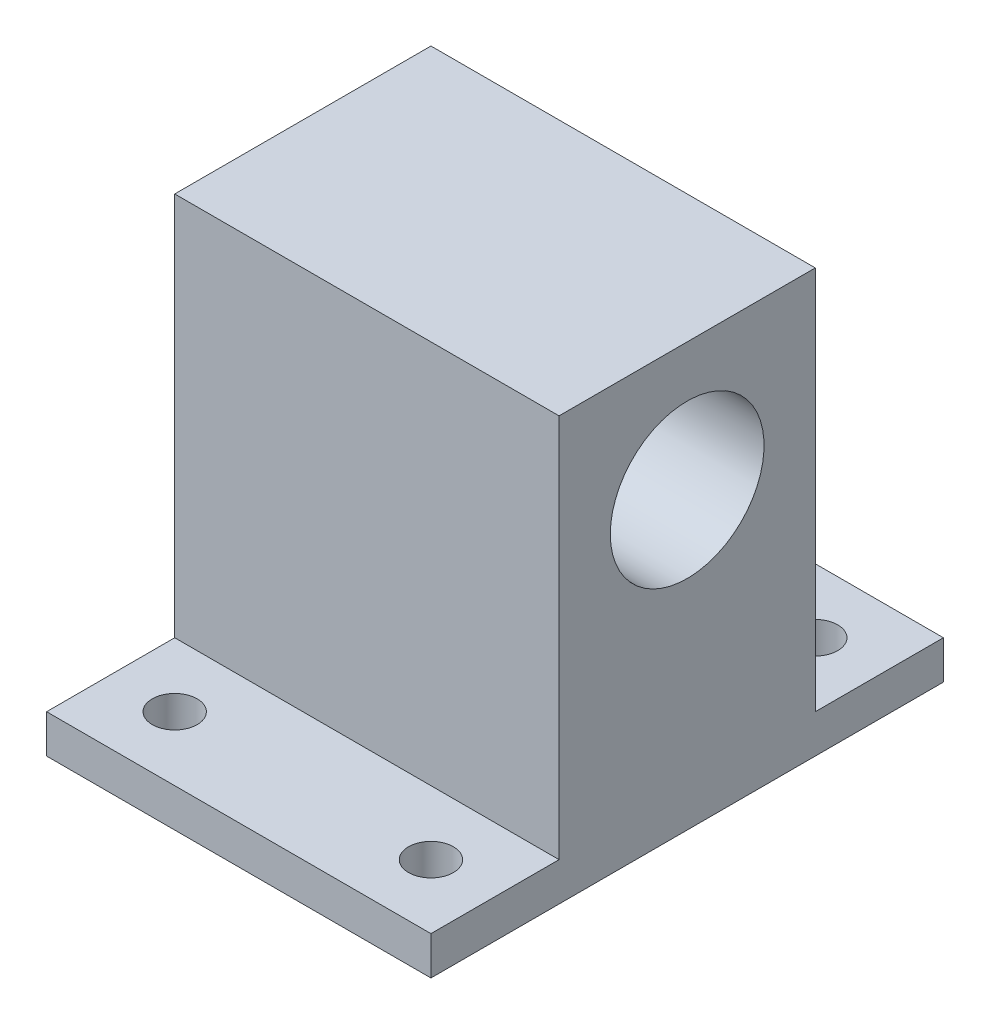
ISO-10303-21;
HEADER;
FILE_DESCRIPTION(('STEP AP214'),'2;1');
FILE_NAME('part.step','',(''),(''),'','','');
FILE_SCHEMA(('AUTOMOTIVE_DESIGN { 1 0 10303 214 1 1 1 1 }'));
ENDSEC;
DATA;
#1=APPLICATION_CONTEXT('core data for automotive mechanical design processes');
#2=APPLICATION_PROTOCOL_DEFINITION('international standard','automotive_design',2000,#1);
#3=PRODUCT_CONTEXT('',#1,'mechanical');
#4=PRODUCT('Part','Part','',(#3));
#5=PRODUCT_RELATED_PRODUCT_CATEGORY('part','',(#4));
#6=PRODUCT_DEFINITION_FORMATION('','',#4);
#7=PRODUCT_DEFINITION_CONTEXT('part definition',#1,'design');
#8=PRODUCT_DEFINITION('design','',#6,#7);
#9=PRODUCT_DEFINITION_SHAPE('','',#8);
#10=(LENGTH_UNIT() NAMED_UNIT(*) SI_UNIT(.MILLI.,.METRE.));
#11=(NAMED_UNIT(*) PLANE_ANGLE_UNIT() SI_UNIT($,.RADIAN.));
#12=(NAMED_UNIT(*) SI_UNIT($,.STERADIAN.) SOLID_ANGLE_UNIT());
#13=UNCERTAINTY_MEASURE_WITH_UNIT(LENGTH_MEASURE(1.E-05),#10,'distance_accuracy_value','');
#14=(GEOMETRIC_REPRESENTATION_CONTEXT(3) GLOBAL_UNCERTAINTY_ASSIGNED_CONTEXT((#13)) GLOBAL_UNIT_ASSIGNED_CONTEXT((#10,
#11,#12)) REPRESENTATION_CONTEXT('',''));
#15=CARTESIAN_POINT('',(0.,0.,0.));
#16=DIRECTION('',(0.,0.,1.));
#17=DIRECTION('',(1.,0.,0.));
#18=AXIS2_PLACEMENT_3D('',#15,#16,#17);
#19=CARTESIAN_POINT('',(0.,3.,0.));
#20=DIRECTION('',(0.,1.,0.));
#21=DIRECTION('',(0.,0.,1.));
#22=AXIS2_PLACEMENT_3D('',#19,#20,#21);
#23=PLANE('',#22);
#24=DIRECTION('',(1.,0.,0.));
#25=VECTOR('',#24,1.);
#26=CARTESIAN_POINT('',(-15.,3.,10.));
#27=LINE('',#26,#25);
#28=CARTESIAN_POINT('',(-15.,3.,10.));
#29=VERTEX_POINT('',#28);
#30=CARTESIAN_POINT('',(15.,3.,10.));
#31=VERTEX_POINT('',#30);
#32=EDGE_CURVE('E61',#29,#31,#27,.T.);
#33=ORIENTED_EDGE('',*,*,#32,.F.);
#34=DIRECTION('',(0.,0.,1.));
#35=VECTOR('',#34,1.);
#36=CARTESIAN_POINT('',(-15.,3.,-20.));
#37=LINE('',#36,#35);
#38=CARTESIAN_POINT('',(-15.,3.,20.));
#39=VERTEX_POINT('',#38);
#40=EDGE_CURVE('E182',#29,#39,#37,.T.);
#41=ORIENTED_EDGE('',*,*,#40,.T.);
#42=DIRECTION('',(1.,0.,0.));
#43=VECTOR('',#42,1.);
#44=CARTESIAN_POINT('',(-15.,3.,20.));
#45=LINE('',#44,#43);
#46=CARTESIAN_POINT('',(15.,3.,20.));
#47=VERTEX_POINT('',#46);
#48=EDGE_CURVE('E186',#39,#47,#45,.T.);
#49=ORIENTED_EDGE('',*,*,#48,.T.);
#50=DIRECTION('',(0.,0.,-1.));
#51=VECTOR('',#50,1.);
#52=CARTESIAN_POINT('',(15.,3.,-20.));
#53=LINE('',#52,#51);
#54=EDGE_CURVE('E176',#47,#31,#53,.T.);
#55=ORIENTED_EDGE('',*,*,#54,.T.);
#56=EDGE_LOOP('',(#33,#41,#49,#55));
#57=FACE_BOUND('',#56,.T.);
#58=CARTESIAN_POINT('',(-9.99999999999969,3.,15.));
#59=DIRECTION('',(0.,1.,0.));
#60=DIRECTION('',(0.,0.,1.));
#61=AXIS2_PLACEMENT_3D('',#58,#59,#60);
#62=CIRCLE('',#61,1.75);
#63=CARTESIAN_POINT('',(-9.99999999999969,3.,16.75));
#64=VERTEX_POINT('',#63);
#65=EDGE_CURVE('E142',#64,#64,#62,.T.);
#66=ORIENTED_EDGE('',*,*,#65,.F.);
#67=EDGE_LOOP('',(#66));
#68=FACE_BOUND('',#67,.T.);
#69=CARTESIAN_POINT('',(10.0000000000003,3.,15.));
#70=DIRECTION('',(0.,1.,0.));
#71=DIRECTION('',(0.,0.,1.));
#72=AXIS2_PLACEMENT_3D('',#69,#70,#71);
#73=CIRCLE('',#72,1.75);
#74=CARTESIAN_POINT('',(10.0000000000003,3.,16.75));
#75=VERTEX_POINT('',#74);
#76=EDGE_CURVE('E152',#75,#75,#73,.T.);
#77=ORIENTED_EDGE('',*,*,#76,.F.);
#78=EDGE_LOOP('',(#77));
#79=FACE_BOUND('',#78,.T.);
#80=ADVANCED_FACE('F45',(#57,#68,#79),#23,.T.);
#81=DIRECTION('',(-1.,0.,0.));
#82=VECTOR('',#81,1.);
#83=CARTESIAN_POINT('',(-15.,3.,-10.));
#84=LINE('',#83,#82);
#85=CARTESIAN_POINT('',(15.,3.,-10.));
#86=VERTEX_POINT('',#85);
#87=CARTESIAN_POINT('',(-15.,3.,-10.));
#88=VERTEX_POINT('',#87);
#89=EDGE_CURVE('E69',#86,#88,#84,.T.);
#90=ORIENTED_EDGE('',*,*,#89,.F.);
#91=CARTESIAN_POINT('',(15.,3.,-20.));
#92=VERTEX_POINT('',#91);
#93=EDGE_CURVE('E135',#86,#92,#53,.T.);
#94=ORIENTED_EDGE('',*,*,#93,.T.);
#95=DIRECTION('',(-1.,0.,0.));
#96=VECTOR('',#95,1.);
#97=CARTESIAN_POINT('',(-15.,3.,-20.));
#98=LINE('',#97,#96);
#99=CARTESIAN_POINT('',(-15.,3.,-20.));
#100=VERTEX_POINT('',#99);
#101=EDGE_CURVE('E179',#92,#100,#98,.T.);
#102=ORIENTED_EDGE('',*,*,#101,.T.);
#103=EDGE_CURVE('E183',#100,#88,#37,.T.);
#104=ORIENTED_EDGE('',*,*,#103,.T.);
#105=EDGE_LOOP('',(#90,#94,#102,#104));
#106=FACE_BOUND('',#105,.T.);
#107=CARTESIAN_POINT('',(-10.,3.,-15.));
#108=DIRECTION('',(0.,1.,0.));
#109=DIRECTION('',(0.,0.,1.));
#110=AXIS2_PLACEMENT_3D('',#107,#108,#109);
#111=CIRCLE('',#110,1.75);
#112=CARTESIAN_POINT('',(-10.,3.,-13.25));
#113=VERTEX_POINT('',#112);
#114=EDGE_CURVE('E168',#113,#113,#111,.T.);
#115=ORIENTED_EDGE('',*,*,#114,.F.);
#116=EDGE_LOOP('',(#115));
#117=FACE_BOUND('',#116,.T.);
#118=CARTESIAN_POINT('',(10.,3.,-15.));
#119=DIRECTION('',(0.,1.,0.));
#120=DIRECTION('',(0.,0.,1.));
#121=AXIS2_PLACEMENT_3D('',#118,#119,#120);
#122=CIRCLE('',#121,1.75);
#123=CARTESIAN_POINT('',(10.,3.,-13.25));
#124=VERTEX_POINT('',#123);
#125=EDGE_CURVE('E160',#124,#124,#122,.T.);
#126=ORIENTED_EDGE('',*,*,#125,.F.);
#127=EDGE_LOOP('',(#126));
#128=FACE_BOUND('',#127,.T.);
#129=ADVANCED_FACE('F271',(#106,#117,#128),#23,.T.);
#130=CARTESIAN_POINT('',(0.,0.,0.));
#131=DIRECTION('',(0.,1.,0.));
#132=DIRECTION('',(0.,0.,1.));
#133=AXIS2_PLACEMENT_3D('',#130,#131,#132);
#134=PLANE('',#133);
#135=DIRECTION('',(0.,0.,-1.));
#136=VECTOR('',#135,1.);
#137=CARTESIAN_POINT('',(15.,0.,-20.));
#138=LINE('',#137,#136);
#139=CARTESIAN_POINT('',(15.,0.,20.));
#140=VERTEX_POINT('',#139);
#141=CARTESIAN_POINT('',(15.,0.,-20.));
#142=VERTEX_POINT('',#141);
#143=EDGE_CURVE('E172',#140,#142,#138,.T.);
#144=ORIENTED_EDGE('',*,*,#143,.F.);
#145=DIRECTION('',(1.,0.,0.));
#146=VECTOR('',#145,1.);
#147=CARTESIAN_POINT('',(-15.,0.,20.));
#148=LINE('',#147,#146);
#149=CARTESIAN_POINT('',(-15.,0.,20.));
#150=VERTEX_POINT('',#149);
#151=EDGE_CURVE('E198',#150,#140,#148,.T.);
#152=ORIENTED_EDGE('',*,*,#151,.F.);
#153=DIRECTION('',(0.,0.,1.));
#154=VECTOR('',#153,1.);
#155=CARTESIAN_POINT('',(-15.,0.,-20.));
#156=LINE('',#155,#154);
#157=CARTESIAN_POINT('',(-15.,0.,-20.));
#158=VERTEX_POINT('',#157);
#159=EDGE_CURVE('E195',#158,#150,#156,.T.);
#160=ORIENTED_EDGE('',*,*,#159,.F.);
#161=DIRECTION('',(-1.,0.,0.));
#162=VECTOR('',#161,1.);
#163=CARTESIAN_POINT('',(-15.,0.,-20.));
#164=LINE('',#163,#162);
#165=EDGE_CURVE('E192',#142,#158,#164,.T.);
#166=ORIENTED_EDGE('',*,*,#165,.F.);
#167=EDGE_LOOP('',(#144,#152,#160,#166));
#168=FACE_BOUND('',#167,.T.);
#169=CARTESIAN_POINT('',(-10.,0.,-15.));
#170=DIRECTION('',(0.,1.,0.));
#171=DIRECTION('',(0.,0.,1.));
#172=AXIS2_PLACEMENT_3D('',#169,#170,#171);
#173=CIRCLE('',#172,1.75);
#174=CARTESIAN_POINT('',(-10.,0.,-13.25));
#175=VERTEX_POINT('',#174);
#176=EDGE_CURVE('E164',#175,#175,#173,.T.);
#177=ORIENTED_EDGE('',*,*,#176,.T.);
#178=EDGE_LOOP('',(#177));
#179=FACE_BOUND('',#178,.T.);
#180=CARTESIAN_POINT('',(10.,0.,-15.));
#181=DIRECTION('',(0.,1.,0.));
#182=DIRECTION('',(0.,0.,1.));
#183=AXIS2_PLACEMENT_3D('',#180,#181,#182);
#184=CIRCLE('',#183,1.75);
#185=CARTESIAN_POINT('',(10.,0.,-13.25));
#186=VERTEX_POINT('',#185);
#187=EDGE_CURVE('E156',#186,#186,#184,.T.);
#188=ORIENTED_EDGE('',*,*,#187,.T.);
#189=EDGE_LOOP('',(#188));
#190=FACE_BOUND('',#189,.T.);
#191=CARTESIAN_POINT('',(10.0000000000003,0.,15.));
#192=DIRECTION('',(0.,1.,0.));
#193=DIRECTION('',(0.,0.,1.));
#194=AXIS2_PLACEMENT_3D('',#191,#192,#193);
#195=CIRCLE('',#194,1.75);
#196=CARTESIAN_POINT('',(10.0000000000003,0.,16.75));
#197=VERTEX_POINT('',#196);
#198=EDGE_CURVE('E150',#197,#197,#195,.T.);
#199=ORIENTED_EDGE('',*,*,#198,.T.);
#200=EDGE_LOOP('',(#199));
#201=FACE_BOUND('',#200,.T.);
#202=CARTESIAN_POINT('',(-9.99999999999969,0.,15.));
#203=DIRECTION('',(0.,1.,0.));
#204=DIRECTION('',(0.,0.,1.));
#205=AXIS2_PLACEMENT_3D('',#202,#203,#204);
#206=CIRCLE('',#205,1.75);
#207=CARTESIAN_POINT('',(-9.99999999999969,0.,16.75));
#208=VERTEX_POINT('',#207);
#209=EDGE_CURVE('E137',#208,#208,#206,.T.);
#210=ORIENTED_EDGE('',*,*,#209,.T.);
#211=EDGE_LOOP('',(#210));
#212=FACE_BOUND('',#211,.T.);
#213=ADVANCED_FACE('F220',(#168,#179,#190,#201,#212),#134,.F.);
#214=CARTESIAN_POINT('',(15.,3.,-20.));
#215=DIRECTION('',(-1.,0.,0.));
#216=DIRECTION('',(0.,0.,1.));
#217=AXIS2_PLACEMENT_3D('',#214,#215,#216);
#218=PLANE('',#217);
#219=CARTESIAN_POINT('',(15.,23.,0.));
#220=DIRECTION('',(-1.,0.,0.));
#221=DIRECTION('',(0.,0.,1.));
#222=AXIS2_PLACEMENT_3D('',#219,#220,#221);
#223=CIRCLE('',#222,6.);
#224=CARTESIAN_POINT('',(15.,23.,6.));
#225=VERTEX_POINT('',#224);
#226=EDGE_CURVE('E236',#225,#225,#223,.T.);
#227=ORIENTED_EDGE('',*,*,#226,.T.);
#228=EDGE_LOOP('',(#227));
#229=FACE_BOUND('',#228,.T.);
#230=ORIENTED_EDGE('',*,*,#143,.T.);
#231=DIRECTION('',(0.,-1.,0.));
#232=VECTOR('',#231,1.);
#233=CARTESIAN_POINT('',(15.,3.,-20.));
#234=LINE('',#233,#232);
#235=EDGE_CURVE('E11',#92,#142,#234,.T.);
#236=ORIENTED_EDGE('',*,*,#235,.F.);
#237=ORIENTED_EDGE('',*,*,#93,.F.);
#238=DIRECTION('',(0.,-1.,0.));
#239=VECTOR('',#238,1.);
#240=CARTESIAN_POINT('',(15.,33.,-10.));
#241=LINE('',#240,#239);
#242=CARTESIAN_POINT('',(15.,33.,-10.));
#243=VERTEX_POINT('',#242);
#244=EDGE_CURVE('E115',#243,#86,#241,.T.);
#245=ORIENTED_EDGE('',*,*,#244,.F.);
#246=DIRECTION('',(0.,0.,-1.));
#247=VECTOR('',#246,1.);
#248=CARTESIAN_POINT('',(15.,33.,-10.));
#249=LINE('',#248,#247);
#250=CARTESIAN_POINT('',(15.,33.,10.));
#251=VERTEX_POINT('',#250);
#252=EDGE_CURVE('E122',#251,#243,#249,.T.);
#253=ORIENTED_EDGE('',*,*,#252,.F.);
#254=DIRECTION('',(0.,-1.,0.));
#255=VECTOR('',#254,1.);
#256=CARTESIAN_POINT('',(15.,33.,10.));
#257=LINE('',#256,#255);
#258=EDGE_CURVE('E227',#251,#31,#257,.T.);
#259=ORIENTED_EDGE('',*,*,#258,.T.);
#260=ORIENTED_EDGE('',*,*,#54,.F.);
#261=DIRECTION('',(0.,-1.,0.));
#262=VECTOR('',#261,1.);
#263=CARTESIAN_POINT('',(15.,3.,20.));
#264=LINE('',#263,#262);
#265=EDGE_CURVE('E189',#47,#140,#264,.T.);
#266=ORIENTED_EDGE('',*,*,#265,.T.);
#267=EDGE_LOOP('',(#230,#236,#237,#245,#253,#259,#260,#266));
#268=FACE_BOUND('',#267,.T.);
#269=ADVANCED_FACE('F47',(#229,#268),#218,.F.);
#270=CARTESIAN_POINT('',(-15.,3.,-20.));
#271=DIRECTION('',(0.,0.,1.));
#272=DIRECTION('',(1.,0.,0.));
#273=AXIS2_PLACEMENT_3D('',#270,#271,#272);
#274=PLANE('',#273);
#275=ORIENTED_EDGE('',*,*,#165,.T.);
#276=DIRECTION('',(0.,-1.,0.));
#277=VECTOR('',#276,1.);
#278=CARTESIAN_POINT('',(-15.,3.,-20.));
#279=LINE('',#278,#277);
#280=EDGE_CURVE('E54',#100,#158,#279,.T.);
#281=ORIENTED_EDGE('',*,*,#280,.F.);
#282=ORIENTED_EDGE('',*,*,#101,.F.);
#283=ORIENTED_EDGE('',*,*,#235,.T.);
#284=EDGE_LOOP('',(#275,#281,#282,#283));
#285=FACE_BOUND('',#284,.T.);
#286=ADVANCED_FACE('F262',(#285),#274,.F.);
#287=CARTESIAN_POINT('',(-15.,3.,-20.));
#288=DIRECTION('',(1.,0.,0.));
#289=DIRECTION('',(0.,0.,-1.));
#290=AXIS2_PLACEMENT_3D('',#287,#288,#289);
#291=PLANE('',#290);
#292=CARTESIAN_POINT('',(-15.,23.,0.));
#293=DIRECTION('',(-1.,0.,0.));
#294=DIRECTION('',(0.,0.,1.));
#295=AXIS2_PLACEMENT_3D('',#292,#293,#294);
#296=CIRCLE('',#295,6.);
#297=CARTESIAN_POINT('',(-15.,23.,6.));
#298=VERTEX_POINT('',#297);
#299=EDGE_CURVE('E246',#298,#298,#296,.T.);
#300=ORIENTED_EDGE('',*,*,#299,.F.);
#301=EDGE_LOOP('',(#300));
#302=FACE_BOUND('',#301,.T.);
#303=ORIENTED_EDGE('',*,*,#159,.T.);
#304=DIRECTION('',(0.,-1.,0.));
#305=VECTOR('',#304,1.);
#306=CARTESIAN_POINT('',(-15.,3.,20.));
#307=LINE('',#306,#305);
#308=EDGE_CURVE('E204',#39,#150,#307,.T.);
#309=ORIENTED_EDGE('',*,*,#308,.F.);
#310=ORIENTED_EDGE('',*,*,#40,.F.);
#311=DIRECTION('',(0.,-1.,0.));
#312=VECTOR('',#311,1.);
#313=CARTESIAN_POINT('',(-15.,33.,10.));
#314=LINE('',#313,#312);
#315=CARTESIAN_POINT('',(-15.,33.,10.));
#316=VERTEX_POINT('',#315);
#317=EDGE_CURVE('E144',#316,#29,#314,.T.);
#318=ORIENTED_EDGE('',*,*,#317,.F.);
#319=DIRECTION('',(0.,0.,1.));
#320=VECTOR('',#319,1.);
#321=CARTESIAN_POINT('',(-15.,33.,-10.));
#322=LINE('',#321,#320);
#323=CARTESIAN_POINT('',(-15.,33.,-10.));
#324=VERTEX_POINT('',#323);
#325=EDGE_CURVE('E121',#324,#316,#322,.T.);
#326=ORIENTED_EDGE('',*,*,#325,.F.);
#327=DIRECTION('',(0.,-1.,0.));
#328=VECTOR('',#327,1.);
#329=CARTESIAN_POINT('',(-15.,33.,-10.));
#330=LINE('',#329,#328);
#331=EDGE_CURVE('E117',#324,#88,#330,.T.);
#332=ORIENTED_EDGE('',*,*,#331,.T.);
#333=ORIENTED_EDGE('',*,*,#103,.F.);
#334=ORIENTED_EDGE('',*,*,#280,.T.);
#335=EDGE_LOOP('',(#303,#309,#310,#318,#326,#332,#333,#334));
#336=FACE_BOUND('',#335,.T.);
#337=ADVANCED_FACE('F213',(#302,#336),#291,.F.);
#338=CARTESIAN_POINT('',(-15.,3.,20.));
#339=DIRECTION('',(0.,0.,-1.));
#340=DIRECTION('',(-1.,0.,0.));
#341=AXIS2_PLACEMENT_3D('',#338,#339,#340);
#342=PLANE('',#341);
#343=ORIENTED_EDGE('',*,*,#151,.T.);
#344=ORIENTED_EDGE('',*,*,#265,.F.);
#345=ORIENTED_EDGE('',*,*,#48,.F.);
#346=ORIENTED_EDGE('',*,*,#308,.T.);
#347=EDGE_LOOP('',(#343,#344,#345,#346));
#348=FACE_BOUND('',#347,.T.);
#349=ADVANCED_FACE('F224',(#348),#342,.F.);
#350=CARTESIAN_POINT('',(-10.,3.,-15.));
#351=DIRECTION('',(0.,-1.,0.));
#352=DIRECTION('',(0.,0.,-1.));
#353=AXIS2_PLACEMENT_3D('',#350,#351,#352);
#354=CYLINDRICAL_SURFACE('',#353,1.75);
#355=ORIENTED_EDGE('',*,*,#114,.T.);
#356=EDGE_LOOP('',(#355));
#357=FACE_BOUND('',#356,.T.);
#358=ORIENTED_EDGE('',*,*,#176,.F.);
#359=EDGE_LOOP('',(#358));
#360=FACE_BOUND('',#359,.T.);
#361=ADVANCED_FACE('F268',(#357,#360),#354,.F.);
#362=CARTESIAN_POINT('',(10.,3.,-15.));
#363=DIRECTION('',(0.,-1.,0.));
#364=DIRECTION('',(0.,0.,-1.));
#365=AXIS2_PLACEMENT_3D('',#362,#363,#364);
#366=CYLINDRICAL_SURFACE('',#365,1.75);
#367=ORIENTED_EDGE('',*,*,#125,.T.);
#368=EDGE_LOOP('',(#367));
#369=FACE_BOUND('',#368,.T.);
#370=ORIENTED_EDGE('',*,*,#187,.F.);
#371=EDGE_LOOP('',(#370));
#372=FACE_BOUND('',#371,.T.);
#373=ADVANCED_FACE('F311',(#369,#372),#366,.F.);
#374=CARTESIAN_POINT('',(10.0000000000003,3.,15.));
#375=DIRECTION('',(0.,-1.,0.));
#376=DIRECTION('',(0.,0.,-1.));
#377=AXIS2_PLACEMENT_3D('',#374,#375,#376);
#378=CYLINDRICAL_SURFACE('',#377,1.75);
#379=ORIENTED_EDGE('',*,*,#76,.T.);
#380=EDGE_LOOP('',(#379));
#381=FACE_BOUND('',#380,.T.);
#382=ORIENTED_EDGE('',*,*,#198,.F.);
#383=EDGE_LOOP('',(#382));
#384=FACE_BOUND('',#383,.T.);
#385=ADVANCED_FACE('F321',(#381,#384),#378,.F.);
#386=CARTESIAN_POINT('',(-9.99999999999969,3.,15.));
#387=DIRECTION('',(0.,-1.,0.));
#388=DIRECTION('',(0.,0.,-1.));
#389=AXIS2_PLACEMENT_3D('',#386,#387,#388);
#390=CYLINDRICAL_SURFACE('',#389,1.75);
#391=ORIENTED_EDGE('',*,*,#65,.T.);
#392=EDGE_LOOP('',(#391));
#393=FACE_BOUND('',#392,.T.);
#394=ORIENTED_EDGE('',*,*,#209,.F.);
#395=EDGE_LOOP('',(#394));
#396=FACE_BOUND('',#395,.T.);
#397=ADVANCED_FACE('F331',(#393,#396),#390,.F.);
#398=CARTESIAN_POINT('',(-15.,33.,-10.));
#399=DIRECTION('',(0.,0.,1.));
#400=DIRECTION('',(1.,0.,0.));
#401=AXIS2_PLACEMENT_3D('',#398,#399,#400);
#402=PLANE('',#401);
#403=ORIENTED_EDGE('',*,*,#89,.T.);
#404=ORIENTED_EDGE('',*,*,#331,.F.);
#405=DIRECTION('',(-1.,0.,0.));
#406=VECTOR('',#405,1.);
#407=CARTESIAN_POINT('',(-15.,33.,-10.));
#408=LINE('',#407,#406);
#409=EDGE_CURVE('E111',#243,#324,#408,.T.);
#410=ORIENTED_EDGE('',*,*,#409,.F.);
#411=ORIENTED_EDGE('',*,*,#244,.T.);
#412=EDGE_LOOP('',(#403,#404,#410,#411));
#413=FACE_BOUND('',#412,.T.);
#414=ADVANCED_FACE('F113',(#413),#402,.F.);
#415=CARTESIAN_POINT('',(-15.,33.,10.));
#416=DIRECTION('',(0.,0.,-1.));
#417=DIRECTION('',(-1.,0.,0.));
#418=AXIS2_PLACEMENT_3D('',#415,#416,#417);
#419=PLANE('',#418);
#420=ORIENTED_EDGE('',*,*,#32,.T.);
#421=ORIENTED_EDGE('',*,*,#258,.F.);
#422=DIRECTION('',(1.,0.,0.));
#423=VECTOR('',#422,1.);
#424=CARTESIAN_POINT('',(-15.,33.,10.));
#425=LINE('',#424,#423);
#426=EDGE_CURVE('E127',#316,#251,#425,.T.);
#427=ORIENTED_EDGE('',*,*,#426,.F.);
#428=ORIENTED_EDGE('',*,*,#317,.T.);
#429=EDGE_LOOP('',(#420,#421,#427,#428));
#430=FACE_BOUND('',#429,.T.);
#431=ADVANCED_FACE('F231',(#430),#419,.F.);
#432=CARTESIAN_POINT('',(0.,33.,0.));
#433=DIRECTION('',(0.,1.,0.));
#434=DIRECTION('',(0.,0.,1.));
#435=AXIS2_PLACEMENT_3D('',#432,#433,#434);
#436=PLANE('',#435);
#437=ORIENTED_EDGE('',*,*,#252,.T.);
#438=ORIENTED_EDGE('',*,*,#409,.T.);
#439=ORIENTED_EDGE('',*,*,#325,.T.);
#440=ORIENTED_EDGE('',*,*,#426,.T.);
#441=EDGE_LOOP('',(#437,#438,#439,#440));
#442=FACE_BOUND('',#441,.T.);
#443=ADVANCED_FACE('F125',(#442),#436,.T.);
#444=CARTESIAN_POINT('',(15.,23.,0.));
#445=DIRECTION('',(-1.,0.,0.));
#446=DIRECTION('',(0.,0.,1.));
#447=AXIS2_PLACEMENT_3D('',#444,#445,#446);
#448=CYLINDRICAL_SURFACE('',#447,6.);
#449=ORIENTED_EDGE('',*,*,#226,.F.);
#450=EDGE_LOOP('',(#449));
#451=FACE_BOUND('',#450,.T.);
#452=ORIENTED_EDGE('',*,*,#299,.T.);
#453=EDGE_LOOP('',(#452));
#454=FACE_BOUND('',#453,.T.);
#455=ADVANCED_FACE('F255',(#451,#454),#448,.F.);
#456=CLOSED_SHELL('',(#80,#129,#213,#269,#286,#337,#349,#361,#373,#385,#397,#414,#431,#443,#455));
#457=MANIFOLD_SOLID_BREP('B2',#456);
#458=ADVANCED_BREP_SHAPE_REPRESENTATION('',(#18,#457),#14);
#459=SHAPE_DEFINITION_REPRESENTATION(#9,#458);
ENDSEC;
END-ISO-10303-21;
